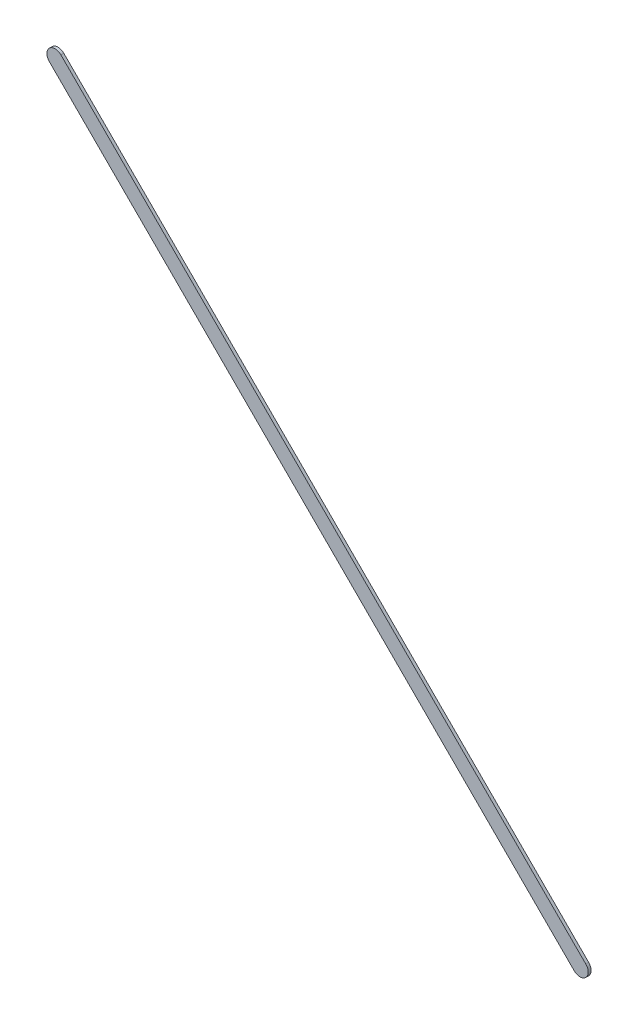
ISO-10303-21;
HEADER;
FILE_DESCRIPTION(('STEP AP214'),'2;1');
FILE_NAME('part.step','',(''),(''),'','','');
FILE_SCHEMA(('AUTOMOTIVE_DESIGN { 1 0 10303 214 1 1 1 1 }'));
ENDSEC;
DATA;
#1=APPLICATION_CONTEXT('core data for automotive mechanical design processes');
#2=APPLICATION_PROTOCOL_DEFINITION('international standard','automotive_design',2000,#1);
#3=PRODUCT_CONTEXT('',#1,'mechanical');
#4=PRODUCT('Part','Part','',(#3));
#5=PRODUCT_RELATED_PRODUCT_CATEGORY('part','',(#4));
#6=PRODUCT_DEFINITION_FORMATION('','',#4);
#7=PRODUCT_DEFINITION_CONTEXT('part definition',#1,'design');
#8=PRODUCT_DEFINITION('design','',#6,#7);
#9=PRODUCT_DEFINITION_SHAPE('','',#8);
#10=(LENGTH_UNIT() NAMED_UNIT(*) SI_UNIT(.MILLI.,.METRE.));
#11=(NAMED_UNIT(*) PLANE_ANGLE_UNIT() SI_UNIT($,.RADIAN.));
#12=(NAMED_UNIT(*) SI_UNIT($,.STERADIAN.) SOLID_ANGLE_UNIT());
#13=UNCERTAINTY_MEASURE_WITH_UNIT(LENGTH_MEASURE(1.E-05),#10,'distance_accuracy_value','');
#14=(GEOMETRIC_REPRESENTATION_CONTEXT(3) GLOBAL_UNCERTAINTY_ASSIGNED_CONTEXT((#13)) GLOBAL_UNIT_ASSIGNED_CONTEXT((#10,
#11,#12)) REPRESENTATION_CONTEXT('',''));
#15=CARTESIAN_POINT('',(0.,0.,0.));
#16=DIRECTION('',(0.,0.,1.));
#17=DIRECTION('',(1.,0.,0.));
#18=AXIS2_PLACEMENT_3D('',#15,#16,#17);
#19=CARTESIAN_POINT('',(113.25171,-133.085539,1.635));
#20=DIRECTION('',(0.,0.,1.));
#21=DIRECTION('',(1.,0.,0.));
#22=AXIS2_PLACEMENT_3D('',#19,#20,#21);
#23=PLANE('',#22);
#24=DIRECTION('',(-0.707106781186548,0.707106781186548,0.));
#25=VECTOR('',#24,1.);
#26=CARTESIAN_POINT('',(113.25171,-133.085539,1.635));
#27=LINE('',#26,#25);
#28=CARTESIAN_POINT('',(113.25171,-133.085539,1.635));
#29=VERTEX_POINT('',#28);
#30=CARTESIAN_POINT('',(106.85546,-126.689289,1.635));
#31=VERTEX_POINT('',#30);
#32=EDGE_CURVE('E95',#29,#31,#27,.T.);
#33=ORIENTED_EDGE('',*,*,#32,.T.);
#34=CARTESIAN_POINT('',(106.7847495,-126.7599995,1.635));
#35=DIRECTION('',(0.,0.,1.));
#36=DIRECTION('',(0.707106781186548,0.707106781186548,0.));
#37=AXIS2_PLACEMENT_3D('',#34,#35,#36);
#38=CIRCLE('',#37,0.09999974810218);
#39=CARTESIAN_POINT('',(106.714039,-126.83071,1.635));
#40=VERTEX_POINT('',#39);
#41=EDGE_CURVE('E74',#31,#40,#38,.T.);
#42=ORIENTED_EDGE('',*,*,#41,.T.);
#43=DIRECTION('',(0.707106781186548,-0.707106781186548,0.));
#44=VECTOR('',#43,1.);
#45=CARTESIAN_POINT('',(106.714039,-126.83071,1.635));
#46=LINE('',#45,#44);
#47=CARTESIAN_POINT('',(113.110289,-133.22696,1.635));
#48=VERTEX_POINT('',#47);
#49=EDGE_CURVE('E79',#40,#48,#46,.T.);
#50=ORIENTED_EDGE('',*,*,#49,.T.);
#51=CARTESIAN_POINT('',(113.1809995,-133.1562495,1.635));
#52=DIRECTION('',(0.,0.,1.));
#53=DIRECTION('',(-0.707106781187048,-0.707106781186048,0.));
#54=AXIS2_PLACEMENT_3D('',#51,#52,#53);
#55=CIRCLE('',#54,0.09999974810218);
#56=EDGE_CURVE('E11',#48,#29,#55,.T.);
#57=ORIENTED_EDGE('',*,*,#56,.T.);
#58=EDGE_LOOP('',(#33,#42,#50,#57));
#59=FACE_BOUND('',#58,.T.);
#60=ADVANCED_FACE('F17',(#59),#23,.T.);
#61=CARTESIAN_POINT('',(113.25171,-133.085539,1.6));
#62=DIRECTION('',(0.,0.,1.));
#63=DIRECTION('',(1.,0.,0.));
#64=AXIS2_PLACEMENT_3D('',#61,#62,#63);
#65=PLANE('',#64);
#66=CARTESIAN_POINT('',(113.1809995,-133.1562495,1.6));
#67=DIRECTION('',(0.,0.,1.));
#68=DIRECTION('',(-0.707106781187048,-0.707106781186048,0.));
#69=AXIS2_PLACEMENT_3D('',#66,#67,#68);
#70=CIRCLE('',#69,0.09999974810218);
#71=CARTESIAN_POINT('',(113.110289,-133.22696,1.6));
#72=VERTEX_POINT('',#71);
#73=CARTESIAN_POINT('',(113.25171,-133.085539,1.6));
#74=VERTEX_POINT('',#73);
#75=EDGE_CURVE('E26',#72,#74,#70,.T.);
#76=ORIENTED_EDGE('',*,*,#75,.F.);
#77=DIRECTION('',(0.707106781186548,-0.707106781186548,0.));
#78=VECTOR('',#77,1.);
#79=CARTESIAN_POINT('',(106.714039,-126.83071,1.6));
#80=LINE('',#79,#78);
#81=CARTESIAN_POINT('',(106.714039,-126.83071,1.6));
#82=VERTEX_POINT('',#81);
#83=EDGE_CURVE('E62',#82,#72,#80,.T.);
#84=ORIENTED_EDGE('',*,*,#83,.F.);
#85=CARTESIAN_POINT('',(106.7847495,-126.7599995,1.6));
#86=DIRECTION('',(0.,0.,1.));
#87=DIRECTION('',(0.707106781186548,0.707106781186548,0.));
#88=AXIS2_PLACEMENT_3D('',#85,#86,#87);
#89=CIRCLE('',#88,0.09999974810218);
#90=CARTESIAN_POINT('',(106.85546,-126.689289,1.6));
#91=VERTEX_POINT('',#90);
#92=EDGE_CURVE('E67',#91,#82,#89,.T.);
#93=ORIENTED_EDGE('',*,*,#92,.F.);
#94=DIRECTION('',(-0.707106781186548,0.707106781186548,0.));
#95=VECTOR('',#94,1.);
#96=CARTESIAN_POINT('',(113.25171,-133.085539,1.6));
#97=LINE('',#96,#95);
#98=EDGE_CURVE('E113',#74,#91,#97,.T.);
#99=ORIENTED_EDGE('',*,*,#98,.F.);
#100=EDGE_LOOP('',(#76,#84,#93,#99));
#101=FACE_BOUND('',#100,.T.);
#102=ADVANCED_FACE('F64',(#101),#65,.F.);
#103=CARTESIAN_POINT('',(113.1809995,-133.1562495,1.6));
#104=DIRECTION('',(0.,0.,-1.));
#105=DIRECTION('',(-0.707106781187048,-0.707106781186048,0.));
#106=AXIS2_PLACEMENT_3D('',#103,#104,#105);
#107=CYLINDRICAL_SURFACE('',#106,0.09999974810218);
#108=ORIENTED_EDGE('',*,*,#75,.T.);
#109=DIRECTION('',(0.,0.,1.));
#110=VECTOR('',#109,1.);
#111=CARTESIAN_POINT('',(113.25171,-133.085539,1.6));
#112=LINE('',#111,#110);
#113=EDGE_CURVE('E89',#74,#29,#112,.T.);
#114=ORIENTED_EDGE('',*,*,#113,.T.);
#115=ORIENTED_EDGE('',*,*,#56,.F.);
#116=DIRECTION('',(0.,0.,1.));
#117=VECTOR('',#116,1.);
#118=CARTESIAN_POINT('',(113.110289,-133.22696,1.6));
#119=LINE('',#118,#117);
#120=EDGE_CURVE('E73',#72,#48,#119,.T.);
#121=ORIENTED_EDGE('',*,*,#120,.F.);
#122=EDGE_LOOP('',(#108,#114,#115,#121));
#123=FACE_BOUND('',#122,.T.);
#124=ADVANCED_FACE('F139',(#123),#107,.T.);
#125=CARTESIAN_POINT('',(106.714039,-126.83071,1.6));
#126=DIRECTION('',(0.707106781186548,0.707106781186548,0.));
#127=DIRECTION('',(0.,0.,-1.));
#128=AXIS2_PLACEMENT_3D('',#125,#126,#127);
#129=PLANE('',#128);
#130=ORIENTED_EDGE('',*,*,#83,.T.);
#131=ORIENTED_EDGE('',*,*,#120,.T.);
#132=ORIENTED_EDGE('',*,*,#49,.F.);
#133=DIRECTION('',(0.,0.,1.));
#134=VECTOR('',#133,1.);
#135=CARTESIAN_POINT('',(106.714039,-126.83071,1.6));
#136=LINE('',#135,#134);
#137=EDGE_CURVE('E77',#82,#40,#136,.T.);
#138=ORIENTED_EDGE('',*,*,#137,.F.);
#139=EDGE_LOOP('',(#130,#131,#132,#138));
#140=FACE_BOUND('',#139,.T.);
#141=ADVANCED_FACE('F78',(#140),#129,.F.);
#142=CARTESIAN_POINT('',(106.7847495,-126.7599995,1.6));
#143=DIRECTION('',(0.,0.,-1.));
#144=DIRECTION('',(0.707106781186548,0.707106781186548,0.));
#145=AXIS2_PLACEMENT_3D('',#142,#143,#144);
#146=CYLINDRICAL_SURFACE('',#145,0.09999974810218);
#147=ORIENTED_EDGE('',*,*,#92,.T.);
#148=ORIENTED_EDGE('',*,*,#137,.T.);
#149=ORIENTED_EDGE('',*,*,#41,.F.);
#150=DIRECTION('',(0.,0.,1.));
#151=VECTOR('',#150,1.);
#152=CARTESIAN_POINT('',(106.85546,-126.689289,1.6));
#153=LINE('',#152,#151);
#154=EDGE_CURVE('E86',#91,#31,#153,.T.);
#155=ORIENTED_EDGE('',*,*,#154,.F.);
#156=EDGE_LOOP('',(#147,#148,#149,#155));
#157=FACE_BOUND('',#156,.T.);
#158=ADVANCED_FACE('F84',(#157),#146,.T.);
#159=CARTESIAN_POINT('',(113.25171,-133.085539,1.6));
#160=DIRECTION('',(-0.707106781186548,-0.707106781186548,0.));
#161=DIRECTION('',(-0.707106781186548,0.707106781186548,0.));
#162=AXIS2_PLACEMENT_3D('',#159,#160,#161);
#163=PLANE('',#162);
#164=ORIENTED_EDGE('',*,*,#98,.T.);
#165=ORIENTED_EDGE('',*,*,#154,.T.);
#166=ORIENTED_EDGE('',*,*,#32,.F.);
#167=ORIENTED_EDGE('',*,*,#113,.F.);
#168=EDGE_LOOP('',(#164,#165,#166,#167));
#169=FACE_BOUND('',#168,.T.);
#170=ADVANCED_FACE('F124',(#169),#163,.F.);
#171=CLOSED_SHELL('',(#60,#102,#124,#141,#158,#170));
#172=MANIFOLD_SOLID_BREP('B1',#171);
#173=ADVANCED_BREP_SHAPE_REPRESENTATION('',(#18,#172),#14);
#174=SHAPE_DEFINITION_REPRESENTATION(#9,#173);
ENDSEC;
END-ISO-10303-21;
